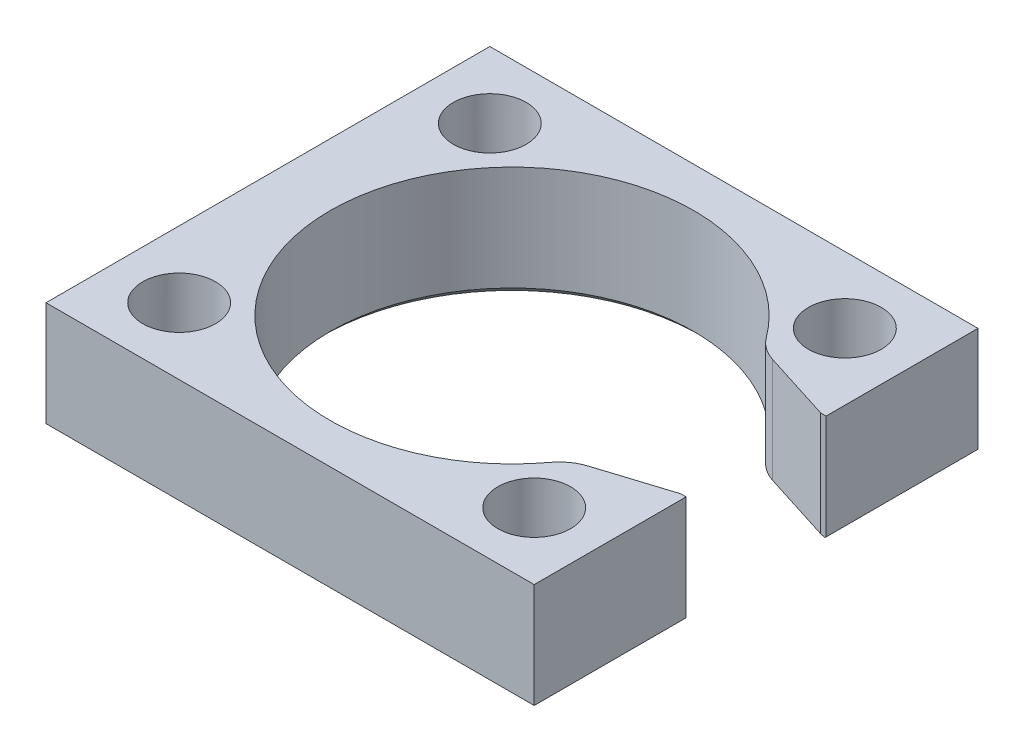
ISO-10303-21;
HEADER;
FILE_DESCRIPTION(('STEP AP214'),'2;1');
FILE_NAME('part.step','',(''),(''),'','','');
FILE_SCHEMA(('AUTOMOTIVE_DESIGN { 1 0 10303 214 1 1 1 1 }'));
ENDSEC;
DATA;
#1=APPLICATION_CONTEXT('core data for automotive mechanical design processes');
#2=APPLICATION_PROTOCOL_DEFINITION('international standard','automotive_design',2000,#1);
#3=PRODUCT_CONTEXT('',#1,'mechanical');
#4=PRODUCT('Part','Part','',(#3));
#5=PRODUCT_RELATED_PRODUCT_CATEGORY('part','',(#4));
#6=PRODUCT_DEFINITION_FORMATION('','',#4);
#7=PRODUCT_DEFINITION_CONTEXT('part definition',#1,'design');
#8=PRODUCT_DEFINITION('design','',#6,#7);
#9=PRODUCT_DEFINITION_SHAPE('','',#8);
#10=(LENGTH_UNIT() NAMED_UNIT(*) SI_UNIT(.MILLI.,.METRE.));
#11=(NAMED_UNIT(*) PLANE_ANGLE_UNIT() SI_UNIT($,.RADIAN.));
#12=(NAMED_UNIT(*) SI_UNIT($,.STERADIAN.) SOLID_ANGLE_UNIT());
#13=UNCERTAINTY_MEASURE_WITH_UNIT(LENGTH_MEASURE(1.E-05),#10,'distance_accuracy_value','');
#14=(GEOMETRIC_REPRESENTATION_CONTEXT(3) GLOBAL_UNCERTAINTY_ASSIGNED_CONTEXT((#13)) GLOBAL_UNIT_ASSIGNED_CONTEXT((#10,
#11,#12)) REPRESENTATION_CONTEXT('',''));
#15=CARTESIAN_POINT('',(0.,0.,0.));
#16=DIRECTION('',(0.,0.,1.));
#17=DIRECTION('',(1.,0.,0.));
#18=AXIS2_PLACEMENT_3D('',#15,#16,#17);
#19=CARTESIAN_POINT('',(17.4625,4.,15.875));
#20=DIRECTION('',(-1.,0.,0.));
#21=DIRECTION('',(0.,0.,1.));
#22=AXIS2_PLACEMENT_3D('',#19,#20,#21);
#23=PLANE('',#22);
#24=DIRECTION('',(0.,1.,0.));
#25=VECTOR('',#24,1.);
#26=CARTESIAN_POINT('',(17.4625,-4.001,-5.008));
#27=LINE('',#26,#25);
#28=CARTESIAN_POINT('',(17.4625,-3.492,-5.008));
#29=VERTEX_POINT('',#28);
#30=CARTESIAN_POINT('',(17.4625,4.,-5.008));
#31=VERTEX_POINT('',#30);
#32=EDGE_CURVE('E182',#29,#31,#27,.T.);
#33=ORIENTED_EDGE('',*,*,#32,.F.);
#34=DIRECTION('',(0.,0.,-1.));
#35=VECTOR('',#34,1.);
#36=CARTESIAN_POINT('',(17.4625,-3.492,-15.875));
#37=LINE('',#36,#35);
#38=CARTESIAN_POINT('',(17.4625,-3.492,-15.875));
#39=VERTEX_POINT('',#38);
#40=EDGE_CURVE('E266',#29,#39,#37,.T.);
#41=ORIENTED_EDGE('',*,*,#40,.T.);
#42=DIRECTION('',(0.,-1.,0.));
#43=VECTOR('',#42,1.);
#44=CARTESIAN_POINT('',(17.4625,4.,-15.875));
#45=LINE('',#44,#43);
#46=CARTESIAN_POINT('',(17.4625,4.,-15.875));
#47=VERTEX_POINT('',#46);
#48=EDGE_CURVE('E208',#47,#39,#45,.T.);
#49=ORIENTED_EDGE('',*,*,#48,.F.);
#50=DIRECTION('',(0.,0.,-1.));
#51=VECTOR('',#50,1.);
#52=CARTESIAN_POINT('',(17.4625,4.,15.875));
#53=LINE('',#52,#51);
#54=EDGE_CURVE('E190',#31,#47,#53,.T.);
#55=ORIENTED_EDGE('',*,*,#54,.F.);
#56=EDGE_LOOP('',(#33,#41,#49,#55));
#57=FACE_BOUND('',#56,.T.);
#58=ADVANCED_FACE('F33',(#57),#23,.F.);
#59=DIRECTION('',(0.,-1.,0.));
#60=VECTOR('',#59,1.);
#61=CARTESIAN_POINT('',(17.4625,4.,15.875));
#62=LINE('',#61,#60);
#63=CARTESIAN_POINT('',(17.4625,4.,15.875));
#64=VERTEX_POINT('',#63);
#65=CARTESIAN_POINT('',(17.4625,-3.492,15.875));
#66=VERTEX_POINT('',#65);
#67=EDGE_CURVE('E200',#64,#66,#62,.T.);
#68=ORIENTED_EDGE('',*,*,#67,.T.);
#69=DIRECTION('',(0.,0.,-1.));
#70=VECTOR('',#69,1.);
#71=CARTESIAN_POINT('',(17.4625,-3.492,5.008));
#72=LINE('',#71,#70);
#73=CARTESIAN_POINT('',(17.4625,-3.492,5.008));
#74=VERTEX_POINT('',#73);
#75=EDGE_CURVE('E181',#66,#74,#72,.T.);
#76=ORIENTED_EDGE('',*,*,#75,.T.);
#77=DIRECTION('',(0.,-1.,0.));
#78=VECTOR('',#77,1.);
#79=CARTESIAN_POINT('',(17.4625,-4.001,5.008));
#80=LINE('',#79,#78);
#81=CARTESIAN_POINT('',(17.4625,4.,5.008));
#82=VERTEX_POINT('',#81);
#83=EDGE_CURVE('E165',#82,#74,#80,.T.);
#84=ORIENTED_EDGE('',*,*,#83,.F.);
#85=EDGE_CURVE('E179',#64,#82,#53,.T.);
#86=ORIENTED_EDGE('',*,*,#85,.F.);
#87=EDGE_LOOP('',(#68,#76,#84,#86));
#88=FACE_BOUND('',#87,.T.);
#89=ADVANCED_FACE('F178',(#88),#23,.F.);
#90=CARTESIAN_POINT('',(-17.4625,4.,-15.875));
#91=DIRECTION('',(0.,0.,1.));
#92=DIRECTION('',(1.,0.,0.));
#93=AXIS2_PLACEMENT_3D('',#90,#91,#92);
#94=PLANE('',#93);
#95=ORIENTED_EDGE('',*,*,#48,.T.);
#96=DIRECTION('',(-1.,0.,0.));
#97=VECTOR('',#96,1.);
#98=CARTESIAN_POINT('',(-17.4625,-3.492,-15.875));
#99=LINE('',#98,#97);
#100=CARTESIAN_POINT('',(-17.4625,-3.492,-15.875));
#101=VERTEX_POINT('',#100);
#102=EDGE_CURVE('E268',#39,#101,#99,.T.);
#103=ORIENTED_EDGE('',*,*,#102,.T.);
#104=DIRECTION('',(0.,-1.,0.));
#105=VECTOR('',#104,1.);
#106=CARTESIAN_POINT('',(-17.4625,4.,-15.875));
#107=LINE('',#106,#105);
#108=CARTESIAN_POINT('',(-17.4625,4.,-15.875));
#109=VERTEX_POINT('',#108);
#110=EDGE_CURVE('E205',#109,#101,#107,.T.);
#111=ORIENTED_EDGE('',*,*,#110,.F.);
#112=DIRECTION('',(-1.,0.,0.));
#113=VECTOR('',#112,1.);
#114=CARTESIAN_POINT('',(-17.4625,4.,-15.875));
#115=LINE('',#114,#113);
#116=EDGE_CURVE('E189',#47,#109,#115,.T.);
#117=ORIENTED_EDGE('',*,*,#116,.F.);
#118=EDGE_LOOP('',(#95,#103,#111,#117));
#119=FACE_BOUND('',#118,.T.);
#120=ADVANCED_FACE('F392',(#119),#94,.F.);
#121=CARTESIAN_POINT('',(-17.4625,4.,15.875));
#122=DIRECTION('',(1.,0.,0.));
#123=DIRECTION('',(0.,0.,-1.));
#124=AXIS2_PLACEMENT_3D('',#121,#122,#123);
#125=PLANE('',#124);
#126=ORIENTED_EDGE('',*,*,#110,.T.);
#127=DIRECTION('',(0.,0.,1.));
#128=VECTOR('',#127,1.);
#129=CARTESIAN_POINT('',(-17.4625,-3.492,15.875));
#130=LINE('',#129,#128);
#131=CARTESIAN_POINT('',(-17.4625,-3.492,15.875));
#132=VERTEX_POINT('',#131);
#133=EDGE_CURVE('E270',#101,#132,#130,.T.);
#134=ORIENTED_EDGE('',*,*,#133,.T.);
#135=DIRECTION('',(0.,-1.,0.));
#136=VECTOR('',#135,1.);
#137=CARTESIAN_POINT('',(-17.4625,4.,15.875));
#138=LINE('',#137,#136);
#139=CARTESIAN_POINT('',(-17.4625,4.,15.875));
#140=VERTEX_POINT('',#139);
#141=EDGE_CURVE('E202',#140,#132,#138,.T.);
#142=ORIENTED_EDGE('',*,*,#141,.F.);
#143=DIRECTION('',(0.,0.,1.));
#144=VECTOR('',#143,1.);
#145=CARTESIAN_POINT('',(-17.4625,4.,15.875));
#146=LINE('',#145,#144);
#147=EDGE_CURVE('E192',#109,#140,#146,.T.);
#148=ORIENTED_EDGE('',*,*,#147,.F.);
#149=EDGE_LOOP('',(#126,#134,#142,#148));
#150=FACE_BOUND('',#149,.T.);
#151=ADVANCED_FACE('F401',(#150),#125,.F.);
#152=CARTESIAN_POINT('',(-17.4625,4.,15.875));
#153=DIRECTION('',(0.,0.,-1.));
#154=DIRECTION('',(-1.,0.,0.));
#155=AXIS2_PLACEMENT_3D('',#152,#153,#154);
#156=PLANE('',#155);
#157=ORIENTED_EDGE('',*,*,#141,.T.);
#158=DIRECTION('',(1.,0.,0.));
#159=VECTOR('',#158,1.);
#160=CARTESIAN_POINT('',(17.4625,-3.492,15.875));
#161=LINE('',#160,#159);
#162=EDGE_CURVE('E272',#132,#66,#161,.T.);
#163=ORIENTED_EDGE('',*,*,#162,.T.);
#164=ORIENTED_EDGE('',*,*,#67,.F.);
#165=DIRECTION('',(1.,0.,0.));
#166=VECTOR('',#165,1.);
#167=CARTESIAN_POINT('',(-17.4625,4.,15.875));
#168=LINE('',#167,#166);
#169=EDGE_CURVE('E187',#140,#64,#168,.T.);
#170=ORIENTED_EDGE('',*,*,#169,.F.);
#171=EDGE_LOOP('',(#157,#163,#164,#170));
#172=FACE_BOUND('',#171,.T.);
#173=ADVANCED_FACE('F405',(#172),#156,.F.);
#174=CARTESIAN_POINT('',(0.,4.,0.));
#175=DIRECTION('',(0.,-1.,0.));
#176=DIRECTION('',(0.,0.,-1.));
#177=AXIS2_PLACEMENT_3D('',#174,#175,#176);
#178=PLANE('',#177);
#179=CARTESIAN_POINT('',(12.7,4.,11.1125));
#180=DIRECTION('',(0.,1.,0.));
#181=DIRECTION('',(0.,0.,1.));
#182=AXIS2_PLACEMENT_3D('',#179,#180,#181);
#183=CIRCLE('',#182,2.6035);
#184=CARTESIAN_POINT('',(12.7,4.,13.716));
#185=VERTEX_POINT('',#184);
#186=EDGE_CURVE('E318',#185,#185,#183,.T.);
#187=ORIENTED_EDGE('',*,*,#186,.F.);
#188=EDGE_LOOP('',(#187));
#189=FACE_BOUND('',#188,.T.);
#190=CARTESIAN_POINT('',(-12.7,4.,11.1125));
#191=DIRECTION('',(0.,1.,0.));
#192=DIRECTION('',(0.,0.,1.));
#193=AXIS2_PLACEMENT_3D('',#190,#191,#192);
#194=CIRCLE('',#193,2.6035);
#195=CARTESIAN_POINT('',(-12.7,4.,13.716));
#196=VERTEX_POINT('',#195);
#197=EDGE_CURVE('E324',#196,#196,#194,.T.);
#198=ORIENTED_EDGE('',*,*,#197,.F.);
#199=EDGE_LOOP('',(#198));
#200=FACE_BOUND('',#199,.T.);
#201=CARTESIAN_POINT('',(12.7,4.,-11.1125));
#202=DIRECTION('',(0.,1.,0.));
#203=DIRECTION('',(0.,0.,1.));
#204=AXIS2_PLACEMENT_3D('',#201,#202,#203);
#205=CIRCLE('',#204,2.6035);
#206=CARTESIAN_POINT('',(12.7,4.,-8.509));
#207=VERTEX_POINT('',#206);
#208=EDGE_CURVE('E329',#207,#207,#205,.T.);
#209=ORIENTED_EDGE('',*,*,#208,.F.);
#210=EDGE_LOOP('',(#209));
#211=FACE_BOUND('',#210,.T.);
#212=CARTESIAN_POINT('',(-12.7,4.,-11.1125));
#213=DIRECTION('',(0.,1.,0.));
#214=DIRECTION('',(0.,0.,1.));
#215=AXIS2_PLACEMENT_3D('',#212,#213,#214);
#216=CIRCLE('',#215,2.6035);
#217=CARTESIAN_POINT('',(-12.7,4.,-8.509));
#218=VERTEX_POINT('',#217);
#219=EDGE_CURVE('E183',#218,#218,#216,.T.);
#220=ORIENTED_EDGE('',*,*,#219,.F.);
#221=EDGE_LOOP('',(#220));
#222=FACE_BOUND('',#221,.T.);
#223=DIRECTION('',(0.953440193148594,0.,-0.301582158107491));
#224=VECTOR('',#223,1.);
#225=CARTESIAN_POINT('',(17.0784276564268,4.,5.008));
#226=LINE('',#225,#224);
#227=CARTESIAN_POINT('',(12.0519819566754,4.,6.59791235384693));
#228=VERTEX_POINT('',#227);
#229=CARTESIAN_POINT('',(17.0784276564268,4.,5.008));
#230=VERTEX_POINT('',#229);
#231=EDGE_CURVE('E173',#228,#230,#226,.T.);
#232=ORIENTED_EDGE('',*,*,#231,.F.);
#233=CARTESIAN_POINT('',(13.0095053086667,4.,9.62508496709372));
#234=DIRECTION('',(0.,-1.,0.));
#235=DIRECTION('',(0.,0.,-1.));
#236=AXIS2_PLACEMENT_3D('',#233,#234,#235);
#237=CIRCLE('',#236,3.175);
#238=CARTESIAN_POINT('',(10.457124454992,4.,7.73670550898814));
#239=VERTEX_POINT('',#238);
#240=EDGE_CURVE('E215',#228,#239,#237,.F.);
#241=ORIENTED_EDGE('',*,*,#240,.T.);
#242=CARTESIAN_POINT('',(0.,4.,0.));
#243=DIRECTION('',(0.,1.,0.));
#244=DIRECTION('',(0.,0.,1.));
#245=AXIS2_PLACEMENT_3D('',#242,#243,#244);
#246=CIRCLE('',#245,13.008);
#247=CARTESIAN_POINT('',(10.457124454992,4.,-7.73670550898814));
#248=VERTEX_POINT('',#247);
#249=EDGE_CURVE('E337',#248,#239,#246,.T.);
#250=ORIENTED_EDGE('',*,*,#249,.F.);
#251=CARTESIAN_POINT('',(13.0095053086667,4.,-9.62508496709372));
#252=DIRECTION('',(0.,-1.,0.));
#253=DIRECTION('',(0.,0.,-1.));
#254=AXIS2_PLACEMENT_3D('',#251,#252,#253);
#255=CIRCLE('',#254,3.175);
#256=CARTESIAN_POINT('',(12.0519819566754,4.,-6.59791235384694));
#257=VERTEX_POINT('',#256);
#258=EDGE_CURVE('E213',#248,#257,#255,.F.);
#259=ORIENTED_EDGE('',*,*,#258,.T.);
#260=DIRECTION('',(-0.953440193148594,0.,-0.301582158107492));
#261=VECTOR('',#260,1.);
#262=CARTESIAN_POINT('',(11.0098691627524,4.,-6.92754249493093));
#263=LINE('',#262,#261);
#264=CARTESIAN_POINT('',(17.0784276564268,4.,-5.008));
#265=VERTEX_POINT('',#264);
#266=EDGE_CURVE('E343',#265,#257,#263,.T.);
#267=ORIENTED_EDGE('',*,*,#266,.F.);
#268=DIRECTION('',(-1.,0.,0.));
#269=VECTOR('',#268,1.);
#270=CARTESIAN_POINT('',(17.0784276564268,4.,-5.008));
#271=LINE('',#270,#269);
#272=EDGE_CURVE('E172',#31,#265,#271,.T.);
#273=ORIENTED_EDGE('',*,*,#272,.F.);
#274=ORIENTED_EDGE('',*,*,#54,.T.);
#275=ORIENTED_EDGE('',*,*,#116,.T.);
#276=ORIENTED_EDGE('',*,*,#147,.T.);
#277=ORIENTED_EDGE('',*,*,#169,.T.);
#278=ORIENTED_EDGE('',*,*,#85,.T.);
#279=DIRECTION('',(1.,0.,0.));
#280=VECTOR('',#279,1.);
#281=CARTESIAN_POINT('',(22.733,4.,5.008));
#282=LINE('',#281,#280);
#283=EDGE_CURVE('E162',#230,#82,#282,.T.);
#284=ORIENTED_EDGE('',*,*,#283,.F.);
#285=EDGE_LOOP('',(#232,#241,#250,#259,#267,#273,#274,#275,#276,#277,#278,#284));
#286=FACE_BOUND('',#285,.T.);
#287=ADVANCED_FACE('F185',(#189,#200,#211,#222,#286),#178,.F.);
#288=CARTESIAN_POINT('',(0.,-4.,0.));
#289=DIRECTION('',(0.,-1.,0.));
#290=DIRECTION('',(0.,0.,-1.));
#291=AXIS2_PLACEMENT_3D('',#288,#289,#290);
#292=PLANE('',#291);
#293=DIRECTION('',(-0.953440193148594,0.,-0.301582158107492));
#294=VECTOR('',#293,1.);
#295=CARTESIAN_POINT('',(12.205185692994,-4.,-7.08225997196642));
#296=LINE('',#295,#294);
#297=CARTESIAN_POINT('',(16.9545,-4.,-5.58000690089788));
#298=VERTEX_POINT('',#297);
#299=CARTESIAN_POINT('',(12.205185692994,-4.,-7.08225997196642));
#300=VERTEX_POINT('',#299);
#301=EDGE_CURVE('E252',#298,#300,#296,.T.);
#302=ORIENTED_EDGE('',*,*,#301,.T.);
#303=CARTESIAN_POINT('',(13.0095053086667,-4.,-9.62508496709372));
#304=DIRECTION('',(0.,-1.,0.));
#305=DIRECTION('',(0.,0.,-1.));
#306=AXIS2_PLACEMENT_3D('',#303,#304,#305);
#307=CIRCLE('',#306,2.667);
#308=CARTESIAN_POINT('',(10.86550539158,-4.,-8.03884622228504));
#309=VERTEX_POINT('',#308);
#310=EDGE_CURVE('E254',#300,#309,#307,.T.);
#311=ORIENTED_EDGE('',*,*,#310,.T.);
#312=CARTESIAN_POINT('',(0.,-4.,0.));
#313=DIRECTION('',(0.,-1.,0.));
#314=DIRECTION('',(0.,0.,-1.));
#315=AXIS2_PLACEMENT_3D('',#312,#313,#314);
#316=CIRCLE('',#315,13.516);
#317=CARTESIAN_POINT('',(10.86550539158,-4.,8.03884622228503));
#318=VERTEX_POINT('',#317);
#319=EDGE_CURVE('E236',#309,#318,#316,.F.);
#320=ORIENTED_EDGE('',*,*,#319,.T.);
#321=CARTESIAN_POINT('',(13.0095053086667,-4.,9.62508496709372));
#322=DIRECTION('',(0.,-1.,0.));
#323=DIRECTION('',(0.,0.,-1.));
#324=AXIS2_PLACEMENT_3D('',#321,#322,#323);
#325=CIRCLE('',#324,2.667);
#326=CARTESIAN_POINT('',(12.205185692994,-4.,7.08225997196641));
#327=VERTEX_POINT('',#326);
#328=EDGE_CURVE('E238',#318,#327,#325,.T.);
#329=ORIENTED_EDGE('',*,*,#328,.T.);
#330=DIRECTION('',(0.953440193148594,0.,-0.301582158107491));
#331=VECTOR('',#330,1.);
#332=CARTESIAN_POINT('',(17.2316313927454,-4.,5.49234761811949));
#333=LINE('',#332,#331);
#334=CARTESIAN_POINT('',(16.9545,-4.,5.58000690089788));
#335=VERTEX_POINT('',#334);
#336=EDGE_CURVE('E240',#327,#335,#333,.T.);
#337=ORIENTED_EDGE('',*,*,#336,.T.);
#338=DIRECTION('',(0.,0.,1.));
#339=VECTOR('',#338,1.);
#340=CARTESIAN_POINT('',(16.9545,-4.,15.875));
#341=LINE('',#340,#339);
#342=CARTESIAN_POINT('',(16.9545,-4.,15.367));
#343=VERTEX_POINT('',#342);
#344=EDGE_CURVE('E242',#335,#343,#341,.T.);
#345=ORIENTED_EDGE('',*,*,#344,.T.);
#346=DIRECTION('',(-1.,0.,0.));
#347=VECTOR('',#346,1.);
#348=CARTESIAN_POINT('',(-17.4625,-4.,15.367));
#349=LINE('',#348,#347);
#350=CARTESIAN_POINT('',(-16.9545,-4.,15.367));
#351=VERTEX_POINT('',#350);
#352=EDGE_CURVE('E244',#343,#351,#349,.T.);
#353=ORIENTED_EDGE('',*,*,#352,.T.);
#354=DIRECTION('',(0.,0.,-1.));
#355=VECTOR('',#354,1.);
#356=CARTESIAN_POINT('',(-16.9545,-4.,-15.875));
#357=LINE('',#356,#355);
#358=CARTESIAN_POINT('',(-16.9545,-4.,-15.367));
#359=VERTEX_POINT('',#358);
#360=EDGE_CURVE('E246',#351,#359,#357,.T.);
#361=ORIENTED_EDGE('',*,*,#360,.T.);
#362=DIRECTION('',(1.,0.,0.));
#363=VECTOR('',#362,1.);
#364=CARTESIAN_POINT('',(17.4625,-4.,-15.367));
#365=LINE('',#364,#363);
#366=CARTESIAN_POINT('',(16.9545,-4.,-15.367));
#367=VERTEX_POINT('',#366);
#368=EDGE_CURVE('E248',#359,#367,#365,.T.);
#369=ORIENTED_EDGE('',*,*,#368,.T.);
#370=DIRECTION('',(0.,0.,1.));
#371=VECTOR('',#370,1.);
#372=CARTESIAN_POINT('',(16.9545,-4.,-5.008));
#373=LINE('',#372,#371);
#374=EDGE_CURVE('E250',#367,#298,#373,.T.);
#375=ORIENTED_EDGE('',*,*,#374,.T.);
#376=EDGE_LOOP('',(#302,#311,#320,#329,#337,#345,#353,#361,#369,#375));
#377=FACE_BOUND('',#376,.T.);
#378=CARTESIAN_POINT('',(-12.7,-4.,-11.1125));
#379=DIRECTION('',(0.,-1.,0.));
#380=DIRECTION('',(0.,0.,-1.));
#381=AXIS2_PLACEMENT_3D('',#378,#379,#380);
#382=CIRCLE('',#381,3.1115);
#383=CARTESIAN_POINT('',(-12.7,-4.,-14.224));
#384=VERTEX_POINT('',#383);
#385=EDGE_CURVE('E233',#384,#384,#382,.F.);
#386=ORIENTED_EDGE('',*,*,#385,.T.);
#387=EDGE_LOOP('',(#386));
#388=FACE_BOUND('',#387,.T.);
#389=CARTESIAN_POINT('',(12.7,-4.,-11.1125));
#390=DIRECTION('',(0.,-1.,0.));
#391=DIRECTION('',(0.,0.,-1.));
#392=AXIS2_PLACEMENT_3D('',#389,#390,#391);
#393=CIRCLE('',#392,3.1115);
#394=CARTESIAN_POINT('',(12.7,-4.,-14.224));
#395=VERTEX_POINT('',#394);
#396=EDGE_CURVE('E230',#395,#395,#393,.F.);
#397=ORIENTED_EDGE('',*,*,#396,.T.);
#398=EDGE_LOOP('',(#397));
#399=FACE_BOUND('',#398,.T.);
#400=CARTESIAN_POINT('',(-12.7,-4.,11.1125));
#401=DIRECTION('',(0.,-1.,0.));
#402=DIRECTION('',(0.,0.,-1.));
#403=AXIS2_PLACEMENT_3D('',#400,#401,#402);
#404=CIRCLE('',#403,3.1115);
#405=CARTESIAN_POINT('',(-12.7,-4.,8.001));
#406=VERTEX_POINT('',#405);
#407=EDGE_CURVE('E227',#406,#406,#404,.F.);
#408=ORIENTED_EDGE('',*,*,#407,.T.);
#409=EDGE_LOOP('',(#408));
#410=FACE_BOUND('',#409,.T.);
#411=CARTESIAN_POINT('',(12.7,-4.,11.1125));
#412=DIRECTION('',(0.,-1.,0.));
#413=DIRECTION('',(0.,0.,-1.));
#414=AXIS2_PLACEMENT_3D('',#411,#412,#413);
#415=CIRCLE('',#414,3.1115);
#416=CARTESIAN_POINT('',(12.7,-4.,8.001));
#417=VERTEX_POINT('',#416);
#418=EDGE_CURVE('E224',#417,#417,#415,.F.);
#419=ORIENTED_EDGE('',*,*,#418,.T.);
#420=EDGE_LOOP('',(#419));
#421=FACE_BOUND('',#420,.T.);
#422=ADVANCED_FACE('F375',(#377,#388,#399,#410,#421),#292,.T.);
#423=CARTESIAN_POINT('',(17.0784276564268,-4.001,-5.008));
#424=DIRECTION('',(0.,0.,-1.));
#425=DIRECTION('',(-1.,0.,0.));
#426=AXIS2_PLACEMENT_3D('',#423,#424,#425);
#427=PLANE('',#426);
#428=DIRECTION('',(0.,1.,0.));
#429=VECTOR('',#428,1.);
#430=CARTESIAN_POINT('',(17.0784276564268,-4.001,-5.008));
#431=LINE('',#430,#429);
#432=CARTESIAN_POINT('',(17.0784276564268,-3.492,-5.008));
#433=VERTEX_POINT('',#432);
#434=EDGE_CURVE('E194',#433,#265,#431,.T.);
#435=ORIENTED_EDGE('',*,*,#434,.F.);
#436=DIRECTION('',(0.957408367509624,-0.288737281663724,0.));
#437=VECTOR('',#436,1.);
#438=CARTESIAN_POINT('',(4.44844398138467,0.316977733581619,-5.008));
#439=LINE('',#438,#437);
#440=CARTESIAN_POINT('',(17.3735087937802,-3.58099120621983,-5.008));
#441=VERTEX_POINT('',#440);
#442=EDGE_CURVE('E264',#433,#441,#439,.T.);
#443=ORIENTED_EDGE('',*,*,#442,.T.);
#444=DIRECTION('',(0.707106781186546,0.707106781186549,0.));
#445=VECTOR('',#444,1.);
#446=CARTESIAN_POINT('',(17.4625,-3.492,-5.008));
#447=LINE('',#446,#445);
#448=EDGE_CURVE('E262',#441,#29,#447,.T.);
#449=ORIENTED_EDGE('',*,*,#448,.T.);
#450=ORIENTED_EDGE('',*,*,#32,.T.);
#451=ORIENTED_EDGE('',*,*,#272,.T.);
#452=EDGE_LOOP('',(#435,#443,#449,#450,#451));
#453=FACE_BOUND('',#452,.T.);
#454=ADVANCED_FACE('F354',(#453),#427,.F.);
#455=CARTESIAN_POINT('',(22.733,-4.001,5.008));
#456=DIRECTION('',(0.,0.,1.));
#457=DIRECTION('',(1.,0.,0.));
#458=AXIS2_PLACEMENT_3D('',#455,#456,#457);
#459=PLANE('',#458);
#460=ORIENTED_EDGE('',*,*,#83,.T.);
#461=DIRECTION('',(-0.707106781186546,-0.707106781186549,0.));
#462=VECTOR('',#461,1.);
#463=CARTESIAN_POINT('',(17.4625,-3.492,5.008));
#464=LINE('',#463,#462);
#465=CARTESIAN_POINT('',(17.3735087937802,-3.58099120621983,5.008));
#466=VERTEX_POINT('',#465);
#467=EDGE_CURVE('E277',#74,#466,#464,.T.);
#468=ORIENTED_EDGE('',*,*,#467,.T.);
#469=DIRECTION('',(-0.957408367509624,0.288737281663723,0.));
#470=VECTOR('',#469,1.);
#471=CARTESIAN_POINT('',(4.44844398138465,0.316977733581612,5.008));
#472=LINE('',#471,#470);
#473=CARTESIAN_POINT('',(17.0784276564268,-3.492,5.008));
#474=VERTEX_POINT('',#473);
#475=EDGE_CURVE('E275',#466,#474,#472,.T.);
#476=ORIENTED_EDGE('',*,*,#475,.T.);
#477=DIRECTION('',(0.,1.,0.));
#478=VECTOR('',#477,1.);
#479=CARTESIAN_POINT('',(17.0784276564268,-4.001,5.008));
#480=LINE('',#479,#478);
#481=EDGE_CURVE('E167',#474,#230,#480,.T.);
#482=ORIENTED_EDGE('',*,*,#481,.T.);
#483=ORIENTED_EDGE('',*,*,#283,.T.);
#484=EDGE_LOOP('',(#460,#468,#476,#482,#483));
#485=FACE_BOUND('',#484,.T.);
#486=ADVANCED_FACE('F164',(#485),#459,.F.);
#487=CARTESIAN_POINT('',(0.,-4.001,0.));
#488=DIRECTION('',(0.,1.,0.));
#489=DIRECTION('',(0.,0.,1.));
#490=AXIS2_PLACEMENT_3D('',#487,#488,#489);
#491=CYLINDRICAL_SURFACE('',#490,13.008);
#492=DIRECTION('',(0.,1.,0.));
#493=VECTOR('',#492,1.);
#494=CARTESIAN_POINT('',(10.457124454992,-4.001,7.73670550898814));
#495=LINE('',#494,#493);
#496=CARTESIAN_POINT('',(10.457124454992,-3.492,7.73670550898814));
#497=VERTEX_POINT('',#496);
#498=EDGE_CURVE('E219',#239,#497,#495,.F.);
#499=ORIENTED_EDGE('',*,*,#498,.T.);
#500=CARTESIAN_POINT('',(0.,-3.492,0.));
#501=DIRECTION('',(0.,-1.,0.));
#502=DIRECTION('',(0.,0.,-1.));
#503=AXIS2_PLACEMENT_3D('',#500,#501,#502);
#504=CIRCLE('',#503,13.008);
#505=CARTESIAN_POINT('',(10.457124454992,-3.492,-7.73670550898814));
#506=VERTEX_POINT('',#505);
#507=EDGE_CURVE('E281',#497,#506,#504,.T.);
#508=ORIENTED_EDGE('',*,*,#507,.T.);
#509=DIRECTION('',(0.,1.,0.));
#510=VECTOR('',#509,1.);
#511=CARTESIAN_POINT('',(10.457124454992,-4.001,-7.73670550898814));
#512=LINE('',#511,#510);
#513=EDGE_CURVE('E217',#506,#248,#512,.T.);
#514=ORIENTED_EDGE('',*,*,#513,.T.);
#515=ORIENTED_EDGE('',*,*,#249,.T.);
#516=EDGE_LOOP('',(#499,#508,#514,#515));
#517=FACE_BOUND('',#516,.T.);
#518=ADVANCED_FACE('F602',(#517),#491,.F.);
#519=CARTESIAN_POINT('',(11.0098691627524,-4.001,-6.92754249493093));
#520=DIRECTION('',(0.301582158107492,0.,-0.953440193148594));
#521=DIRECTION('',(-0.953440193148594,0.,-0.301582158107492));
#522=AXIS2_PLACEMENT_3D('',#519,#520,#521);
#523=PLANE('',#522);
#524=DIRECTION('',(0.,1.,0.));
#525=VECTOR('',#524,1.);
#526=CARTESIAN_POINT('',(12.0519819566754,-4.001,-6.59791235384694));
#527=LINE('',#526,#525);
#528=CARTESIAN_POINT('',(12.0519819566754,-3.492,-6.59791235384694));
#529=VERTEX_POINT('',#528);
#530=EDGE_CURVE('E221',#257,#529,#527,.F.);
#531=ORIENTED_EDGE('',*,*,#530,.T.);
#532=DIRECTION('',(0.953440193148594,0.,0.301582158107492));
#533=VECTOR('',#532,1.);
#534=CARTESIAN_POINT('',(17.0784276564268,-3.492,-5.008));
#535=LINE('',#534,#533);
#536=EDGE_CURVE('E260',#529,#433,#535,.T.);
#537=ORIENTED_EDGE('',*,*,#536,.T.);
#538=ORIENTED_EDGE('',*,*,#434,.T.);
#539=ORIENTED_EDGE('',*,*,#266,.T.);
#540=EDGE_LOOP('',(#531,#537,#538,#539));
#541=FACE_BOUND('',#540,.T.);
#542=ADVANCED_FACE('F347',(#541),#523,.F.);
#543=CARTESIAN_POINT('',(17.0784276564268,-4.001,5.008));
#544=DIRECTION('',(0.301582158107491,0.,0.953440193148594));
#545=DIRECTION('',(0.953440193148594,0.,-0.301582158107491));
#546=AXIS2_PLACEMENT_3D('',#543,#544,#545);
#547=PLANE('',#546);
#548=ORIENTED_EDGE('',*,*,#481,.F.);
#549=DIRECTION('',(-0.953440193148594,0.,0.301582158107491));
#550=VECTOR('',#549,1.);
#551=CARTESIAN_POINT('',(12.0519819566754,-3.492,6.59791235384693));
#552=LINE('',#551,#550);
#553=CARTESIAN_POINT('',(12.0519819566754,-3.492,6.59791235384693));
#554=VERTEX_POINT('',#553);
#555=EDGE_CURVE('E58',#474,#554,#552,.T.);
#556=ORIENTED_EDGE('',*,*,#555,.T.);
#557=DIRECTION('',(0.,1.,0.));
#558=VECTOR('',#557,1.);
#559=CARTESIAN_POINT('',(12.0519819566754,-4.001,6.59791235384693));
#560=LINE('',#559,#558);
#561=EDGE_CURVE('E211',#554,#228,#560,.T.);
#562=ORIENTED_EDGE('',*,*,#561,.T.);
#563=ORIENTED_EDGE('',*,*,#231,.T.);
#564=EDGE_LOOP('',(#548,#556,#562,#563));
#565=FACE_BOUND('',#564,.T.);
#566=ADVANCED_FACE('F413',(#565),#547,.F.);
#567=CARTESIAN_POINT('',(13.0095053086667,-4.001,9.62508496709372));
#568=DIRECTION('',(0.,1.,0.));
#569=DIRECTION('',(0.,0.,1.));
#570=AXIS2_PLACEMENT_3D('',#567,#568,#569);
#571=CYLINDRICAL_SURFACE('',#570,3.175);
#572=ORIENTED_EDGE('',*,*,#561,.F.);
#573=CARTESIAN_POINT('',(13.0095053086667,-3.492,9.62508496709372));
#574=DIRECTION('',(0.,-1.,0.));
#575=DIRECTION('',(0.,0.,-1.));
#576=AXIS2_PLACEMENT_3D('',#573,#574,#575);
#577=CIRCLE('',#576,3.175);
#578=EDGE_CURVE('E50',#554,#497,#577,.F.);
#579=ORIENTED_EDGE('',*,*,#578,.T.);
#580=ORIENTED_EDGE('',*,*,#498,.F.);
#581=ORIENTED_EDGE('',*,*,#240,.F.);
#582=EDGE_LOOP('',(#572,#579,#580,#581));
#583=FACE_BOUND('',#582,.T.);
#584=ADVANCED_FACE('F436',(#583),#571,.T.);
#585=CARTESIAN_POINT('',(13.0095053086667,-4.001,-9.62508496709372));
#586=DIRECTION('',(0.,1.,0.));
#587=DIRECTION('',(0.,0.,1.));
#588=AXIS2_PLACEMENT_3D('',#585,#586,#587);
#589=CYLINDRICAL_SURFACE('',#588,3.175);
#590=ORIENTED_EDGE('',*,*,#513,.F.);
#591=CARTESIAN_POINT('',(13.0095053086667,-3.492,-9.62508496709372));
#592=DIRECTION('',(0.,-1.,0.));
#593=DIRECTION('',(0.,0.,-1.));
#594=AXIS2_PLACEMENT_3D('',#591,#592,#593);
#595=CIRCLE('',#594,3.175);
#596=EDGE_CURVE('E257',#506,#529,#595,.F.);
#597=ORIENTED_EDGE('',*,*,#596,.T.);
#598=ORIENTED_EDGE('',*,*,#530,.F.);
#599=ORIENTED_EDGE('',*,*,#258,.F.);
#600=EDGE_LOOP('',(#590,#597,#598,#599));
#601=FACE_BOUND('',#600,.T.);
#602=ADVANCED_FACE('F361',(#601),#589,.T.);
#603=CARTESIAN_POINT('',(-12.7,-4.001,-11.1125));
#604=DIRECTION('',(0.,1.,0.));
#605=DIRECTION('',(0.,0.,1.));
#606=AXIS2_PLACEMENT_3D('',#603,#604,#605);
#607=CYLINDRICAL_SURFACE('',#606,2.6035);
#608=CARTESIAN_POINT('',(-12.7,-3.492,-11.1125));
#609=DIRECTION('',(0.,-1.,0.));
#610=DIRECTION('',(0.,0.,-1.));
#611=AXIS2_PLACEMENT_3D('',#608,#609,#610);
#612=CIRCLE('',#611,2.6035);
#613=CARTESIAN_POINT('',(-12.7,-3.492,-13.716));
#614=VERTEX_POINT('',#613);
#615=EDGE_CURVE('E283',#614,#614,#612,.T.);
#616=ORIENTED_EDGE('',*,*,#615,.T.);
#617=EDGE_LOOP('',(#616));
#618=FACE_BOUND('',#617,.T.);
#619=ORIENTED_EDGE('',*,*,#219,.T.);
#620=EDGE_LOOP('',(#619));
#621=FACE_BOUND('',#620,.T.);
#622=ADVANCED_FACE('F441',(#618,#621),#607,.F.);
#623=CARTESIAN_POINT('',(12.7,-4.001,-11.1125));
#624=DIRECTION('',(0.,1.,0.));
#625=DIRECTION('',(0.,0.,1.));
#626=AXIS2_PLACEMENT_3D('',#623,#624,#625);
#627=CYLINDRICAL_SURFACE('',#626,2.6035);
#628=CARTESIAN_POINT('',(12.7,-3.492,-11.1125));
#629=DIRECTION('',(0.,-1.,0.));
#630=DIRECTION('',(0.,0.,-1.));
#631=AXIS2_PLACEMENT_3D('',#628,#629,#630);
#632=CIRCLE('',#631,2.6035);
#633=CARTESIAN_POINT('',(12.7,-3.492,-13.716));
#634=VERTEX_POINT('',#633);
#635=EDGE_CURVE('E286',#634,#634,#632,.T.);
#636=ORIENTED_EDGE('',*,*,#635,.T.);
#637=EDGE_LOOP('',(#636));
#638=FACE_BOUND('',#637,.T.);
#639=ORIENTED_EDGE('',*,*,#208,.T.);
#640=EDGE_LOOP('',(#639));
#641=FACE_BOUND('',#640,.T.);
#642=ADVANCED_FACE('F560',(#638,#641),#627,.F.);
#643=CARTESIAN_POINT('',(-12.7,-4.001,11.1125));
#644=DIRECTION('',(0.,1.,0.));
#645=DIRECTION('',(0.,0.,1.));
#646=AXIS2_PLACEMENT_3D('',#643,#644,#645);
#647=CYLINDRICAL_SURFACE('',#646,2.6035);
#648=CARTESIAN_POINT('',(-12.7,-3.492,11.1125));
#649=DIRECTION('',(0.,-1.,0.));
#650=DIRECTION('',(0.,0.,-1.));
#651=AXIS2_PLACEMENT_3D('',#648,#649,#650);
#652=CIRCLE('',#651,2.6035);
#653=CARTESIAN_POINT('',(-12.7,-3.492,8.509));
#654=VERTEX_POINT('',#653);
#655=EDGE_CURVE('E42',#654,#654,#652,.T.);
#656=ORIENTED_EDGE('',*,*,#655,.T.);
#657=EDGE_LOOP('',(#656));
#658=FACE_BOUND('',#657,.T.);
#659=ORIENTED_EDGE('',*,*,#197,.T.);
#660=EDGE_LOOP('',(#659));
#661=FACE_BOUND('',#660,.T.);
#662=ADVANCED_FACE('F551',(#658,#661),#647,.F.);
#663=CARTESIAN_POINT('',(12.7,-4.001,11.1125));
#664=DIRECTION('',(0.,1.,0.));
#665=DIRECTION('',(0.,0.,1.));
#666=AXIS2_PLACEMENT_3D('',#663,#664,#665);
#667=CYLINDRICAL_SURFACE('',#666,2.6035);
#668=CARTESIAN_POINT('',(12.7,-3.492,11.1125));
#669=DIRECTION('',(0.,-1.,0.));
#670=DIRECTION('',(0.,0.,-1.));
#671=AXIS2_PLACEMENT_3D('',#668,#669,#670);
#672=CIRCLE('',#671,2.6035);
#673=CARTESIAN_POINT('',(12.7,-3.492,8.509));
#674=VERTEX_POINT('',#673);
#675=EDGE_CURVE('E11',#674,#674,#672,.T.);
#676=ORIENTED_EDGE('',*,*,#675,.T.);
#677=EDGE_LOOP('',(#676));
#678=FACE_BOUND('',#677,.T.);
#679=ORIENTED_EDGE('',*,*,#186,.T.);
#680=EDGE_LOOP('',(#679));
#681=FACE_BOUND('',#680,.T.);
#682=ADVANCED_FACE('F543',(#678,#681),#667,.F.);
#683=CARTESIAN_POINT('',(-17.4625,-3.492,15.875));
#684=DIRECTION('',(0.,-0.707106781186545,0.70710678118655));
#685=DIRECTION('',(-1.,0.,0.));
#686=AXIS2_PLACEMENT_3D('',#683,#684,#685);
#687=PLANE('',#686);
#688=DIRECTION('',(-0.577350269189626,-0.577350269189628,-0.577350269189624));
#689=VECTOR('',#688,1.);
#690=CARTESIAN_POINT('',(17.4625,-3.492,15.875));
#691=LINE('',#690,#689);
#692=EDGE_CURVE('E312',#66,#343,#691,.T.);
#693=ORIENTED_EDGE('',*,*,#692,.F.);
#694=ORIENTED_EDGE('',*,*,#162,.F.);
#695=DIRECTION('',(0.577350269189626,-0.577350269189628,-0.577350269189624));
#696=VECTOR('',#695,1.);
#697=CARTESIAN_POINT('',(-17.4625,-3.492,15.875));
#698=LINE('',#697,#696);
#699=EDGE_CURVE('E37',#351,#132,#698,.F.);
#700=ORIENTED_EDGE('',*,*,#699,.F.);
#701=ORIENTED_EDGE('',*,*,#352,.F.);
#702=EDGE_LOOP('',(#693,#694,#700,#701));
#703=FACE_BOUND('',#702,.T.);
#704=ADVANCED_FACE('F407',(#703),#687,.T.);
#705=CARTESIAN_POINT('',(-17.4625,-3.492,15.875));
#706=DIRECTION('',(-0.707106781186549,-0.707106781186546,0.));
#707=DIRECTION('',(0.,0.,-1.));
#708=AXIS2_PLACEMENT_3D('',#705,#706,#707);
#709=PLANE('',#708);
#710=ORIENTED_EDGE('',*,*,#699,.T.);
#711=ORIENTED_EDGE('',*,*,#133,.F.);
#712=DIRECTION('',(0.577350269189626,-0.577350269189628,0.577350269189624));
#713=VECTOR('',#712,1.);
#714=CARTESIAN_POINT('',(-6.8791666666667,-14.0753333333333,-5.29166666666674));
#715=LINE('',#714,#713);
#716=EDGE_CURVE('E310',#359,#101,#715,.F.);
#717=ORIENTED_EDGE('',*,*,#716,.F.);
#718=ORIENTED_EDGE('',*,*,#360,.F.);
#719=EDGE_LOOP('',(#710,#711,#717,#718));
#720=FACE_BOUND('',#719,.T.);
#721=ADVANCED_FACE('F398',(#720),#709,.T.);
#722=CARTESIAN_POINT('',(17.4625,-3.492,15.875));
#723=DIRECTION('',(0.707106781186549,-0.707106781186546,0.));
#724=DIRECTION('',(0.,0.,1.));
#725=AXIS2_PLACEMENT_3D('',#722,#723,#724);
#726=PLANE('',#725);
#727=ORIENTED_EDGE('',*,*,#692,.T.);
#728=ORIENTED_EDGE('',*,*,#344,.F.);
#729=DIRECTION('',(-0.508748407540757,-0.508748407540759,0.694514301976198));
#730=VECTOR('',#729,1.);
#731=CARTESIAN_POINT('',(11.83743500523,-9.11706499476998,12.5655321041877));
#732=LINE('',#731,#730);
#733=EDGE_CURVE('E307',#466,#335,#732,.T.);
#734=ORIENTED_EDGE('',*,*,#733,.F.);
#735=ORIENTED_EDGE('',*,*,#467,.F.);
#736=ORIENTED_EDGE('',*,*,#75,.F.);
#737=EDGE_LOOP('',(#727,#728,#734,#735,#736));
#738=FACE_BOUND('',#737,.T.);
#739=ADVANCED_FACE('F409',(#738),#726,.T.);
#740=CARTESIAN_POINT('',(-17.4625,-3.492,-15.875));
#741=DIRECTION('',(0.,-0.707106781186545,-0.70710678118655));
#742=DIRECTION('',(1.,0.,0.));
#743=AXIS2_PLACEMENT_3D('',#740,#741,#742);
#744=PLANE('',#743);
#745=ORIENTED_EDGE('',*,*,#716,.T.);
#746=ORIENTED_EDGE('',*,*,#102,.F.);
#747=DIRECTION('',(-0.577350269189626,-0.577350269189628,0.577350269189624));
#748=VECTOR('',#747,1.);
#749=CARTESIAN_POINT('',(5.82083333333333,-15.1336666666667,-4.23333333333337));
#750=LINE('',#749,#748);
#751=EDGE_CURVE('E304',#367,#39,#750,.F.);
#752=ORIENTED_EDGE('',*,*,#751,.F.);
#753=ORIENTED_EDGE('',*,*,#368,.F.);
#754=EDGE_LOOP('',(#745,#746,#752,#753));
#755=FACE_BOUND('',#754,.T.);
#756=ADVANCED_FACE('F395',(#755),#744,.T.);
#757=CARTESIAN_POINT('',(3.14652051998912,-4.,9.94760151313449));
#758=DIRECTION('',(-0.213250789082681,-0.707106781186546,-0.674184026031184));
#759=DIRECTION('',(-0.953440193148594,0.,0.301582158107491));
#760=AXIS2_PLACEMENT_3D('',#757,#758,#759);
#761=PLANE('',#760);
#762=ORIENTED_EDGE('',*,*,#733,.T.);
#763=ORIENTED_EDGE('',*,*,#336,.F.);
#764=DIRECTION('',(0.21325078908268,-0.707106781186549,0.674184026031181));
#765=VECTOR('',#764,1.);
#766=CARTESIAN_POINT('',(12.0519819566754,-3.492,6.59791235384693));
#767=LINE('',#766,#765);
#768=EDGE_CURVE('E301',#554,#327,#767,.T.);
#769=ORIENTED_EDGE('',*,*,#768,.F.);
#770=ORIENTED_EDGE('',*,*,#555,.F.);
#771=ORIENTED_EDGE('',*,*,#475,.F.);
#772=EDGE_LOOP('',(#762,#763,#769,#770,#771));
#773=FACE_BOUND('',#772,.T.);
#774=ADVANCED_FACE('F415',(#773),#761,.T.);
#775=CARTESIAN_POINT('',(17.4625,-3.492,15.875));
#776=DIRECTION('',(0.707106781186549,-0.707106781186546,0.));
#777=DIRECTION('',(0.,0.,1.));
#778=AXIS2_PLACEMENT_3D('',#775,#776,#777);
#779=PLANE('',#778);
#780=ORIENTED_EDGE('',*,*,#40,.F.);
#781=ORIENTED_EDGE('',*,*,#448,.F.);
#782=DIRECTION('',(-0.508748407540757,-0.508748407540758,-0.694514301976199));
#783=VECTOR('',#782,1.);
#784=CARTESIAN_POINT('',(24.7982290631442,3.84372906314427,5.12780453287773));
#785=LINE('',#784,#783);
#786=EDGE_CURVE('E298',#298,#441,#785,.F.);
#787=ORIENTED_EDGE('',*,*,#786,.F.);
#788=ORIENTED_EDGE('',*,*,#374,.F.);
#789=ORIENTED_EDGE('',*,*,#751,.T.);
#790=EDGE_LOOP('',(#780,#781,#787,#788,#789));
#791=FACE_BOUND('',#790,.T.);
#792=ADVANCED_FACE('F385',(#791),#779,.T.);
#793=CARTESIAN_POINT('',(13.0095053086667,-4.,9.62508496709372));
#794=DIRECTION('',(0.,1.,0.));
#795=DIRECTION('',(0.,0.,1.));
#796=AXIS2_PLACEMENT_3D('',#793,#794,#795);
#797=CONICAL_SURFACE('',#796,2.667,0.785398163397444);
#798=ORIENTED_EDGE('',*,*,#768,.T.);
#799=ORIENTED_EDGE('',*,*,#328,.F.);
#800=DIRECTION('',(0.568442774741429,-0.707106781186551,0.420562494576323));
#801=VECTOR('',#800,1.);
#802=CARTESIAN_POINT('',(10.457124454992,-3.492,7.73670550898814));
#803=LINE('',#802,#801);
#804=EDGE_CURVE('E295',#497,#318,#803,.T.);
#805=ORIENTED_EDGE('',*,*,#804,.F.);
#806=ORIENTED_EDGE('',*,*,#578,.F.);
#807=EDGE_LOOP('',(#798,#799,#805,#806));
#808=FACE_BOUND('',#807,.T.);
#809=ADVANCED_FACE('F418',(#808),#797,.T.);
#810=CARTESIAN_POINT('',(3.14652051998913,-4.,-9.9476015131345));
#811=DIRECTION('',(-0.213250789082681,-0.707106781186546,0.674184026031184));
#812=DIRECTION('',(0.953440193148594,0.,0.301582158107492));
#813=AXIS2_PLACEMENT_3D('',#810,#811,#812);
#814=PLANE('',#813);
#815=ORIENTED_EDGE('',*,*,#442,.F.);
#816=ORIENTED_EDGE('',*,*,#536,.F.);
#817=DIRECTION('',(-0.213250789082681,0.707106781186548,0.674184026031181));
#818=VECTOR('',#817,1.);
#819=CARTESIAN_POINT('',(12.205185692994,-4.,-7.08225997196642));
#820=LINE('',#819,#818);
#821=EDGE_CURVE('E293',#300,#529,#820,.T.);
#822=ORIENTED_EDGE('',*,*,#821,.F.);
#823=ORIENTED_EDGE('',*,*,#301,.F.);
#824=ORIENTED_EDGE('',*,*,#786,.T.);
#825=EDGE_LOOP('',(#815,#816,#822,#823,#824));
#826=FACE_BOUND('',#825,.T.);
#827=ADVANCED_FACE('F381',(#826),#814,.T.);
#828=CARTESIAN_POINT('',(0.,-4.,0.));
#829=DIRECTION('',(0.,-1.,0.));
#830=DIRECTION('',(0.,0.,-1.));
#831=AXIS2_PLACEMENT_3D('',#828,#829,#830);
#832=CONICAL_SURFACE('',#831,13.516,0.785398163397443);
#833=ORIENTED_EDGE('',*,*,#804,.T.);
#834=ORIENTED_EDGE('',*,*,#319,.F.);
#835=DIRECTION('',(0.568442774741429,-0.707106781186551,-0.420562494576324));
#836=VECTOR('',#835,1.);
#837=CARTESIAN_POINT('',(10.457124454992,-3.492,-7.73670550898814));
#838=LINE('',#837,#836);
#839=EDGE_CURVE('E291',#506,#309,#838,.T.);
#840=ORIENTED_EDGE('',*,*,#839,.F.);
#841=ORIENTED_EDGE('',*,*,#507,.F.);
#842=EDGE_LOOP('',(#833,#834,#840,#841));
#843=FACE_BOUND('',#842,.T.);
#844=ADVANCED_FACE('F371',(#843),#832,.F.);
#845=CARTESIAN_POINT('',(13.0095053086667,-4.,-9.62508496709372));
#846=DIRECTION('',(0.,1.,0.));
#847=DIRECTION('',(0.,0.,1.));
#848=AXIS2_PLACEMENT_3D('',#845,#846,#847);
#849=CONICAL_SURFACE('',#848,2.667,0.785398163397445);
#850=ORIENTED_EDGE('',*,*,#821,.T.);
#851=ORIENTED_EDGE('',*,*,#596,.F.);
#852=ORIENTED_EDGE('',*,*,#839,.T.);
#853=ORIENTED_EDGE('',*,*,#310,.F.);
#854=EDGE_LOOP('',(#850,#851,#852,#853));
#855=FACE_BOUND('',#854,.T.);
#856=ADVANCED_FACE('F365',(#855),#849,.T.);
#857=CARTESIAN_POINT('',(-12.7,-4.,-11.1125));
#858=DIRECTION('',(0.,-1.,0.));
#859=DIRECTION('',(0.,0.,-1.));
#860=AXIS2_PLACEMENT_3D('',#857,#858,#859);
#861=CONICAL_SURFACE('',#860,3.1115,0.78539816339745);
#862=ORIENTED_EDGE('',*,*,#615,.F.);
#863=EDGE_LOOP('',(#862));
#864=FACE_BOUND('',#863,.T.);
#865=ORIENTED_EDGE('',*,*,#385,.F.);
#866=EDGE_LOOP('',(#865));
#867=FACE_BOUND('',#866,.T.);
#868=ADVANCED_FACE('F444',(#864,#867),#861,.F.);
#869=CARTESIAN_POINT('',(12.7,-4.,-11.1125));
#870=DIRECTION('',(0.,-1.,0.));
#871=DIRECTION('',(0.,0.,-1.));
#872=AXIS2_PLACEMENT_3D('',#869,#870,#871);
#873=CONICAL_SURFACE('',#872,3.1115,0.78539816339745);
#874=ORIENTED_EDGE('',*,*,#635,.F.);
#875=EDGE_LOOP('',(#874));
#876=FACE_BOUND('',#875,.T.);
#877=ORIENTED_EDGE('',*,*,#396,.F.);
#878=EDGE_LOOP('',(#877));
#879=FACE_BOUND('',#878,.T.);
#880=ADVANCED_FACE('F460',(#876,#879),#873,.F.);
#881=CARTESIAN_POINT('',(-12.7,-4.,11.1125));
#882=DIRECTION('',(0.,-1.,0.));
#883=DIRECTION('',(0.,0.,-1.));
#884=AXIS2_PLACEMENT_3D('',#881,#882,#883);
#885=CONICAL_SURFACE('',#884,3.1115,0.78539816339745);
#886=ORIENTED_EDGE('',*,*,#655,.F.);
#887=EDGE_LOOP('',(#886));
#888=FACE_BOUND('',#887,.T.);
#889=ORIENTED_EDGE('',*,*,#407,.F.);
#890=EDGE_LOOP('',(#889));
#891=FACE_BOUND('',#890,.T.);
#892=ADVANCED_FACE('F468',(#888,#891),#885,.F.);
#893=CARTESIAN_POINT('',(12.7,-4.,11.1125));
#894=DIRECTION('',(0.,-1.,0.));
#895=DIRECTION('',(0.,0.,-1.));
#896=AXIS2_PLACEMENT_3D('',#893,#894,#895);
#897=CONICAL_SURFACE('',#896,3.1115,0.78539816339745);
#898=ORIENTED_EDGE('',*,*,#675,.F.);
#899=EDGE_LOOP('',(#898));
#900=FACE_BOUND('',#899,.T.);
#901=ORIENTED_EDGE('',*,*,#418,.F.);
#902=EDGE_LOOP('',(#901));
#903=FACE_BOUND('',#902,.T.);
#904=ADVANCED_FACE('F35',(#900,#903),#897,.F.);
#905=CLOSED_SHELL('',(#58,#89,#120,#151,#173,#287,#422,#454,#486,#518,#542,#566,#584,#602,#622,
#642,#662,#682,#704,#721,#739,#756,#774,#792,#809,#827,#844,#856,#868,#880,#892,#904));
#906=MANIFOLD_SOLID_BREP('B2',#905);
#907=ADVANCED_BREP_SHAPE_REPRESENTATION('',(#18,#906),#14);
#908=SHAPE_DEFINITION_REPRESENTATION(#9,#907);
ENDSEC;
END-ISO-10303-21;
